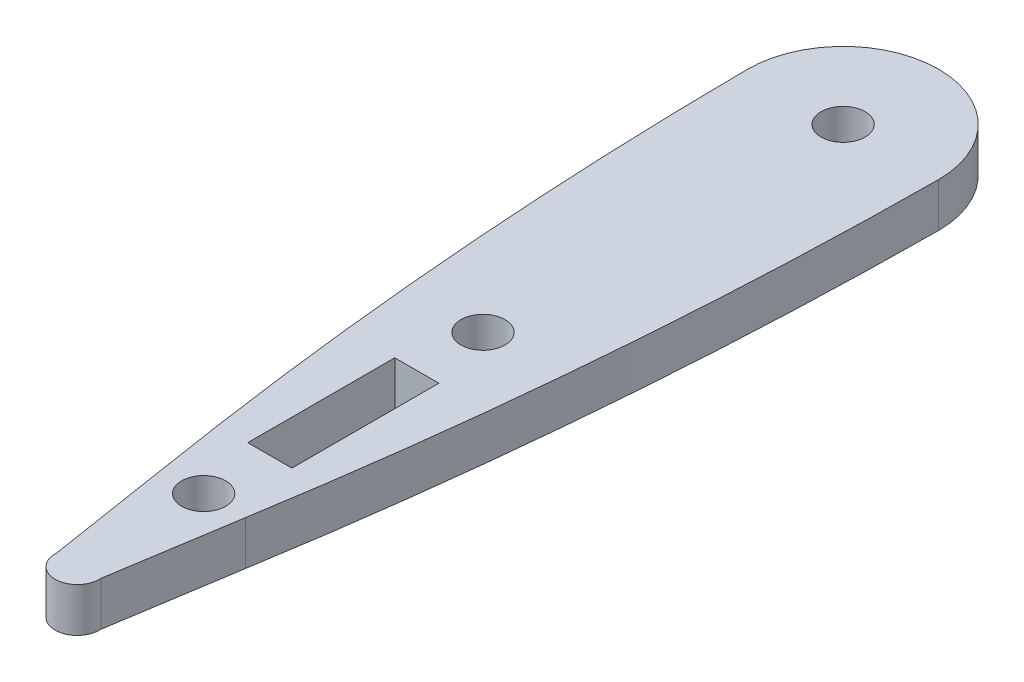
ISO-10303-21;
HEADER;
FILE_DESCRIPTION(('STEP AP214'),'2;1');
FILE_NAME('part.step','',(''),(''),'','','');
FILE_SCHEMA(('AUTOMOTIVE_DESIGN { 1 0 10303 214 1 1 1 1 }'));
ENDSEC;
DATA;
#1=APPLICATION_CONTEXT('core data for automotive mechanical design processes');
#2=APPLICATION_PROTOCOL_DEFINITION('international standard','automotive_design',2000,#1);
#3=PRODUCT_CONTEXT('',#1,'mechanical');
#4=PRODUCT('Part','Part','',(#3));
#5=PRODUCT_RELATED_PRODUCT_CATEGORY('part','',(#4));
#6=PRODUCT_DEFINITION_FORMATION('','',#4);
#7=PRODUCT_DEFINITION_CONTEXT('part definition',#1,'design');
#8=PRODUCT_DEFINITION('design','',#6,#7);
#9=PRODUCT_DEFINITION_SHAPE('','',#8);
#10=(LENGTH_UNIT() NAMED_UNIT(*) SI_UNIT(.MILLI.,.METRE.));
#11=(NAMED_UNIT(*) PLANE_ANGLE_UNIT() SI_UNIT($,.RADIAN.));
#12=(NAMED_UNIT(*) SI_UNIT($,.STERADIAN.) SOLID_ANGLE_UNIT());
#13=UNCERTAINTY_MEASURE_WITH_UNIT(LENGTH_MEASURE(1.E-05),#10,'distance_accuracy_value','');
#14=(GEOMETRIC_REPRESENTATION_CONTEXT(3) GLOBAL_UNCERTAINTY_ASSIGNED_CONTEXT((#13)) GLOBAL_UNIT_ASSIGNED_CONTEXT((#10,
#11,#12)) REPRESENTATION_CONTEXT('',''));
#15=CARTESIAN_POINT('',(0.,0.,0.));
#16=DIRECTION('',(0.,0.,1.));
#17=DIRECTION('',(1.,0.,0.));
#18=AXIS2_PLACEMENT_3D('',#15,#16,#17);
#19=CARTESIAN_POINT('',(-6.68295913760338,3.,1.05274298810732));
#20=DIRECTION('',(-0.987818942901524,0.,0.155607634918458));
#21=DIRECTION('',(0.155607634918458,0.,0.987818942901524));
#22=AXIS2_PLACEMENT_3D('',#19,#20,#21);
#23=PLANE('',#22);
#24=DIRECTION('',(-0.155607634918458,0.,-0.987818942901524));
#25=VECTOR('',#24,1.);
#26=CARTESIAN_POINT('',(-6.68295913760338,0.,1.05274298810732));
#27=LINE('',#26,#25);
#28=CARTESIAN_POINT('',(-1.49999999999999,0.,33.9548895896676));
#29=VERTEX_POINT('',#28);
#30=CARTESIAN_POINT('',(-2.83897502807733,0.,25.4548895896676));
#31=VERTEX_POINT('',#30);
#32=EDGE_CURVE('E172',#29,#31,#27,.T.);
#33=ORIENTED_EDGE('',*,*,#32,.F.);
#34=DIRECTION('',(0.,-1.,0.));
#35=VECTOR('',#34,1.);
#36=CARTESIAN_POINT('',(-1.49999999999999,3.,33.9548895896676));
#37=LINE('',#36,#35);
#38=CARTESIAN_POINT('',(-1.49999999999999,3.,33.9548895896676));
#39=VERTEX_POINT('',#38);
#40=EDGE_CURVE('E11',#39,#29,#37,.T.);
#41=ORIENTED_EDGE('',*,*,#40,.F.);
#42=DIRECTION('',(-0.155607634918458,0.,-0.987818942901524));
#43=VECTOR('',#42,1.);
#44=CARTESIAN_POINT('',(-6.68295913760338,3.,1.05274298810732));
#45=LINE('',#44,#43);
#46=CARTESIAN_POINT('',(-2.83897502807733,3.,25.4548895896676));
#47=VERTEX_POINT('',#46);
#48=EDGE_CURVE('E199',#39,#47,#45,.T.);
#49=ORIENTED_EDGE('',*,*,#48,.T.);
#50=DIRECTION('',(0.,-1.,0.));
#51=VECTOR('',#50,1.);
#52=CARTESIAN_POINT('',(-2.83897502807733,3.,25.4548895896676));
#53=LINE('',#52,#51);
#54=EDGE_CURVE('E53',#47,#31,#53,.T.);
#55=ORIENTED_EDGE('',*,*,#54,.T.);
#56=EDGE_LOOP('',(#33,#41,#49,#55));
#57=FACE_BOUND('',#56,.T.);
#58=ADVANCED_FACE('F34',(#57),#23,.T.);
#59=CARTESIAN_POINT('',(0.,3.,34.053618364937));
#60=DIRECTION('',(0.,-1.,0.));
#61=DIRECTION('',(0.,0.,-1.));
#62=AXIS2_PLACEMENT_3D('',#59,#60,#61);
#63=CYLINDRICAL_SURFACE('',#62,1.50324561235554);
#64=CARTESIAN_POINT('',(0.,0.,34.053618364937));
#65=DIRECTION('',(0.,1.,0.));
#66=DIRECTION('',(0.,0.,1.));
#67=AXIS2_PLACEMENT_3D('',#64,#65,#66);
#68=CIRCLE('',#67,1.50324561235554);
#69=CARTESIAN_POINT('',(1.50000000000001,0.,33.9548895896676));
#70=VERTEX_POINT('',#69);
#71=EDGE_CURVE('E169',#29,#70,#68,.T.);
#72=ORIENTED_EDGE('',*,*,#71,.T.);
#73=DIRECTION('',(0.,-1.,0.));
#74=VECTOR('',#73,1.);
#75=CARTESIAN_POINT('',(1.50000000000001,3.,33.9548895896676));
#76=LINE('',#75,#74);
#77=CARTESIAN_POINT('',(1.50000000000001,3.,33.9548895896676));
#78=VERTEX_POINT('',#77);
#79=EDGE_CURVE('E44',#78,#70,#76,.T.);
#80=ORIENTED_EDGE('',*,*,#79,.F.);
#81=CARTESIAN_POINT('',(0.,3.,34.053618364937));
#82=DIRECTION('',(0.,1.,0.));
#83=DIRECTION('',(0.,0.,1.));
#84=AXIS2_PLACEMENT_3D('',#81,#82,#83);
#85=CIRCLE('',#84,1.50324561235554);
#86=EDGE_CURVE('E197',#39,#78,#85,.T.);
#87=ORIENTED_EDGE('',*,*,#86,.F.);
#88=ORIENTED_EDGE('',*,*,#40,.T.);
#89=EDGE_LOOP('',(#72,#80,#87,#88));
#90=FACE_BOUND('',#89,.T.);
#91=ADVANCED_FACE('F252',(#90),#63,.T.);
#92=CARTESIAN_POINT('',(6.68295913760763,3.,1.05274298810889));
#93=DIRECTION('',(-0.987818942901503,0.,-0.155607634918589));
#94=DIRECTION('',(-0.155607634918589,0.,0.987818942901503));
#95=AXIS2_PLACEMENT_3D('',#92,#93,#94);
#96=PLANE('',#95);
#97=DIRECTION('',(0.155607634918589,0.,-0.987818942901503));
#98=VECTOR('',#97,1.);
#99=CARTESIAN_POINT('',(6.68295913760763,0.,1.05274298810889));
#100=LINE('',#99,#98);
#101=CARTESIAN_POINT('',(2.8389750280785,0.,25.4548895896676));
#102=VERTEX_POINT('',#101);
#103=EDGE_CURVE('E166',#70,#102,#100,.T.);
#104=ORIENTED_EDGE('',*,*,#103,.T.);
#105=DIRECTION('',(0.,-1.,0.));
#106=VECTOR('',#105,1.);
#107=CARTESIAN_POINT('',(2.8389750280785,3.,25.4548895896676));
#108=LINE('',#107,#106);
#109=CARTESIAN_POINT('',(2.8389750280785,3.,25.4548895896676));
#110=VERTEX_POINT('',#109);
#111=EDGE_CURVE('E140',#110,#102,#108,.T.);
#112=ORIENTED_EDGE('',*,*,#111,.F.);
#113=DIRECTION('',(0.155607634918589,0.,-0.987818942901503));
#114=VECTOR('',#113,1.);
#115=CARTESIAN_POINT('',(6.68295913760763,3.,1.05274298810889));
#116=LINE('',#115,#114);
#117=EDGE_CURVE('E133',#78,#110,#116,.T.);
#118=ORIENTED_EDGE('',*,*,#117,.F.);
#119=ORIENTED_EDGE('',*,*,#79,.T.);
#120=EDGE_LOOP('',(#104,#112,#118,#119));
#121=FACE_BOUND('',#120,.T.);
#122=ADVANCED_FACE('F257',(#121),#96,.F.);
#123=CARTESIAN_POINT('',(-275.460870532675,3.,-19.8712997483175));
#124=DIRECTION('',(0.,-1.,0.));
#125=DIRECTION('',(0.,0.,-1.));
#126=AXIS2_PLACEMENT_3D('',#123,#124,#125);
#127=CYLINDRICAL_SURFACE('',#126,281.96678435419);
#128=CARTESIAN_POINT('',(-275.460870532675,0.,-19.8712997483175));
#129=DIRECTION('',(0.,1.,0.));
#130=DIRECTION('',(0.,0.,1.));
#131=AXIS2_PLACEMENT_3D('',#128,#129,#130);
#132=CIRCLE('',#131,281.96678435419);
#133=CARTESIAN_POINT('',(6.50000000000003,0.,-18.0451104103327));
#134=VERTEX_POINT('',#133);
#135=EDGE_CURVE('E139',#102,#134,#132,.T.);
#136=ORIENTED_EDGE('',*,*,#135,.T.);
#137=DIRECTION('',(0.,-1.,0.));
#138=VECTOR('',#137,1.);
#139=CARTESIAN_POINT('',(6.50000000000003,3.,-18.0451104103327));
#140=LINE('',#139,#138);
#141=CARTESIAN_POINT('',(6.50000000000003,3.,-18.0451104103327));
#142=VERTEX_POINT('',#141);
#143=EDGE_CURVE('E122',#142,#134,#140,.T.);
#144=ORIENTED_EDGE('',*,*,#143,.F.);
#145=CARTESIAN_POINT('',(-275.460870532675,3.,-19.8712997483175));
#146=DIRECTION('',(0.,1.,0.));
#147=DIRECTION('',(0.,0.,1.));
#148=AXIS2_PLACEMENT_3D('',#145,#146,#147);
#149=CIRCLE('',#148,281.96678435419);
#150=EDGE_CURVE('E127',#110,#142,#149,.T.);
#151=ORIENTED_EDGE('',*,*,#150,.F.);
#152=ORIENTED_EDGE('',*,*,#111,.T.);
#153=EDGE_LOOP('',(#136,#144,#151,#152));
#154=FACE_BOUND('',#153,.T.);
#155=ADVANCED_FACE('F138',(#154),#127,.T.);
#156=CARTESIAN_POINT('',(-4.52762827229947E-13,3.,-18.0451104103996));
#157=DIRECTION('',(0.,-1.,0.));
#158=DIRECTION('',(0.,0.,-1.));
#159=AXIS2_PLACEMENT_3D('',#156,#157,#158);
#160=CYLINDRICAL_SURFACE('',#159,6.50000000000048);
#161=CARTESIAN_POINT('',(-4.52762827229947E-13,0.,-18.0451104103996));
#162=DIRECTION('',(0.,1.,0.));
#163=DIRECTION('',(0.,0.,1.));
#164=AXIS2_PLACEMENT_3D('',#161,#162,#163);
#165=CIRCLE('',#164,6.50000000000048);
#166=CARTESIAN_POINT('',(-6.50000000000093,0.,-18.0451104106928));
#167=VERTEX_POINT('',#166);
#168=EDGE_CURVE('E163',#134,#167,#165,.T.);
#169=ORIENTED_EDGE('',*,*,#168,.T.);
#170=DIRECTION('',(0.,-1.,0.));
#171=VECTOR('',#170,1.);
#172=CARTESIAN_POINT('',(-6.50000000000093,3.,-18.0451104106928));
#173=LINE('',#172,#171);
#174=CARTESIAN_POINT('',(-6.50000000000093,3.,-18.0451104106928));
#175=VERTEX_POINT('',#174);
#176=EDGE_CURVE('E85',#175,#167,#173,.T.);
#177=ORIENTED_EDGE('',*,*,#176,.F.);
#178=CARTESIAN_POINT('',(-4.52762827229947E-13,3.,-18.0451104103996));
#179=DIRECTION('',(0.,1.,0.));
#180=DIRECTION('',(0.,0.,1.));
#181=AXIS2_PLACEMENT_3D('',#178,#179,#180);
#182=CIRCLE('',#181,6.50000000000048);
#183=EDGE_CURVE('E118',#142,#175,#182,.T.);
#184=ORIENTED_EDGE('',*,*,#183,.F.);
#185=ORIENTED_EDGE('',*,*,#143,.T.);
#186=EDGE_LOOP('',(#169,#177,#184,#185));
#187=FACE_BOUND('',#186,.T.);
#188=ADVANCED_FACE('F120',(#187),#160,.T.);
#189=CARTESIAN_POINT('',(0.,3.,20.9548895896676));
#190=DIRECTION('',(0.,0.,-1.));
#191=DIRECTION('',(-1.,0.,0.));
#192=AXIS2_PLACEMENT_3D('',#189,#190,#191);
#193=PLANE('',#192);
#194=DIRECTION('',(1.,0.,0.));
#195=VECTOR('',#194,1.);
#196=CARTESIAN_POINT('',(0.,0.,20.9548895896676));
#197=LINE('',#196,#195);
#198=CARTESIAN_POINT('',(-1.49999999999992,0.,20.9548895896676));
#199=VERTEX_POINT('',#198);
#200=CARTESIAN_POINT('',(1.50000000000009,0.,20.9548895896676));
#201=VERTEX_POINT('',#200);
#202=EDGE_CURVE('E189',#199,#201,#197,.T.);
#203=ORIENTED_EDGE('',*,*,#202,.F.);
#204=DIRECTION('',(0.,-1.,0.));
#205=VECTOR('',#204,1.);
#206=CARTESIAN_POINT('',(-1.49999999999992,3.,20.9548895896676));
#207=LINE('',#206,#205);
#208=CARTESIAN_POINT('',(-1.49999999999992,3.,20.9548895896676));
#209=VERTEX_POINT('',#208);
#210=EDGE_CURVE('E38',#209,#199,#207,.T.);
#211=ORIENTED_EDGE('',*,*,#210,.F.);
#212=DIRECTION('',(1.,0.,0.));
#213=VECTOR('',#212,1.);
#214=CARTESIAN_POINT('',(0.,3.,20.9548895896676));
#215=LINE('',#214,#213);
#216=CARTESIAN_POINT('',(1.50000000000009,3.,20.9548895896676));
#217=VERTEX_POINT('',#216);
#218=EDGE_CURVE('E213',#209,#217,#215,.T.);
#219=ORIENTED_EDGE('',*,*,#218,.T.);
#220=DIRECTION('',(0.,-1.,0.));
#221=VECTOR('',#220,1.);
#222=CARTESIAN_POINT('',(1.50000000000009,3.,20.9548895896676));
#223=LINE('',#222,#221);
#224=EDGE_CURVE('E148',#217,#201,#223,.T.);
#225=ORIENTED_EDGE('',*,*,#224,.T.);
#226=EDGE_LOOP('',(#203,#211,#219,#225));
#227=FACE_BOUND('',#226,.T.);
#228=ADVANCED_FACE('F272',(#227),#193,.T.);
#229=CARTESIAN_POINT('',(-1.49999999999992,3.,0.));
#230=DIRECTION('',(1.,0.,0.));
#231=DIRECTION('',(0.,0.,-1.));
#232=AXIS2_PLACEMENT_3D('',#229,#230,#231);
#233=PLANE('',#232);
#234=DIRECTION('',(0.,0.,1.));
#235=VECTOR('',#234,1.);
#236=CARTESIAN_POINT('',(-1.49999999999992,0.,0.));
#237=LINE('',#236,#235);
#238=CARTESIAN_POINT('',(-1.49999999999992,0.,10.9548895896676));
#239=VERTEX_POINT('',#238);
#240=EDGE_CURVE('E186',#239,#199,#237,.T.);
#241=ORIENTED_EDGE('',*,*,#240,.F.);
#242=DIRECTION('',(0.,-1.,0.));
#243=VECTOR('',#242,1.);
#244=CARTESIAN_POINT('',(-1.49999999999992,3.,10.9548895896676));
#245=LINE('',#244,#243);
#246=CARTESIAN_POINT('',(-1.49999999999992,3.,10.9548895896676));
#247=VERTEX_POINT('',#246);
#248=EDGE_CURVE('E151',#247,#239,#245,.T.);
#249=ORIENTED_EDGE('',*,*,#248,.F.);
#250=DIRECTION('',(0.,0.,1.));
#251=VECTOR('',#250,1.);
#252=CARTESIAN_POINT('',(-1.49999999999992,3.,0.));
#253=LINE('',#252,#251);
#254=EDGE_CURVE('E211',#247,#209,#253,.T.);
#255=ORIENTED_EDGE('',*,*,#254,.T.);
#256=ORIENTED_EDGE('',*,*,#210,.T.);
#257=EDGE_LOOP('',(#241,#249,#255,#256));
#258=FACE_BOUND('',#257,.T.);
#259=ADVANCED_FACE('F270',(#258),#233,.T.);
#260=CARTESIAN_POINT('',(0.,3.,10.9548895896676));
#261=DIRECTION('',(0.,0.,1.));
#262=DIRECTION('',(1.,0.,0.));
#263=AXIS2_PLACEMENT_3D('',#260,#261,#262);
#264=PLANE('',#263);
#265=DIRECTION('',(-1.,0.,0.));
#266=VECTOR('',#265,1.);
#267=CARTESIAN_POINT('',(0.,0.,10.9548895896676));
#268=LINE('',#267,#266);
#269=CARTESIAN_POINT('',(1.50000000000009,0.,10.9548895896676));
#270=VERTEX_POINT('',#269);
#271=EDGE_CURVE('E183',#270,#239,#268,.T.);
#272=ORIENTED_EDGE('',*,*,#271,.F.);
#273=DIRECTION('',(0.,-1.,0.));
#274=VECTOR('',#273,1.);
#275=CARTESIAN_POINT('',(1.50000000000009,3.,10.9548895896676));
#276=LINE('',#275,#274);
#277=CARTESIAN_POINT('',(1.50000000000009,3.,10.9548895896676));
#278=VERTEX_POINT('',#277);
#279=EDGE_CURVE('E150',#278,#270,#276,.T.);
#280=ORIENTED_EDGE('',*,*,#279,.F.);
#281=DIRECTION('',(-1.,0.,0.));
#282=VECTOR('',#281,1.);
#283=CARTESIAN_POINT('',(0.,3.,10.9548895896676));
#284=LINE('',#283,#282);
#285=EDGE_CURVE('E209',#278,#247,#284,.T.);
#286=ORIENTED_EDGE('',*,*,#285,.T.);
#287=ORIENTED_EDGE('',*,*,#248,.T.);
#288=EDGE_LOOP('',(#272,#280,#286,#287));
#289=FACE_BOUND('',#288,.T.);
#290=ADVANCED_FACE('F235',(#289),#264,.T.);
#291=CARTESIAN_POINT('',(0.,3.,25.4548895896676));
#292=DIRECTION('',(0.,-1.,0.));
#293=DIRECTION('',(0.,0.,-1.));
#294=AXIS2_PLACEMENT_3D('',#291,#292,#293);
#295=CYLINDRICAL_SURFACE('',#294,1.5);
#296=CARTESIAN_POINT('',(0.,3.,25.4548895896676));
#297=DIRECTION('',(0.,1.,0.));
#298=DIRECTION('',(0.,0.,1.));
#299=AXIS2_PLACEMENT_3D('',#296,#297,#298);
#300=CIRCLE('',#299,1.5);
#301=CARTESIAN_POINT('',(0.,3.,26.9548895896676));
#302=VERTEX_POINT('',#301);
#303=EDGE_CURVE('E201',#302,#302,#300,.T.);
#304=ORIENTED_EDGE('',*,*,#303,.T.);
#305=EDGE_LOOP('',(#304));
#306=FACE_BOUND('',#305,.T.);
#307=CARTESIAN_POINT('',(0.,0.,25.4548895896676));
#308=DIRECTION('',(0.,1.,0.));
#309=DIRECTION('',(0.,0.,1.));
#310=AXIS2_PLACEMENT_3D('',#307,#308,#309);
#311=CIRCLE('',#310,1.5);
#312=CARTESIAN_POINT('',(0.,0.,26.9548895896676));
#313=VERTEX_POINT('',#312);
#314=EDGE_CURVE('E174',#313,#313,#311,.T.);
#315=ORIENTED_EDGE('',*,*,#314,.F.);
#316=EDGE_LOOP('',(#315));
#317=FACE_BOUND('',#316,.T.);
#318=ADVANCED_FACE('F231',(#306,#317),#295,.F.);
#319=CARTESIAN_POINT('',(0.,3.,6.45488958966763));
#320=DIRECTION('',(0.,-1.,0.));
#321=DIRECTION('',(0.,0.,-1.));
#322=AXIS2_PLACEMENT_3D('',#319,#320,#321);
#323=CYLINDRICAL_SURFACE('',#322,1.5);
#324=CARTESIAN_POINT('',(0.,3.,6.45488958966763));
#325=DIRECTION('',(0.,1.,0.));
#326=DIRECTION('',(0.,0.,1.));
#327=AXIS2_PLACEMENT_3D('',#324,#325,#326);
#328=CIRCLE('',#327,1.5);
#329=CARTESIAN_POINT('',(0.,3.,7.95488958966763));
#330=VERTEX_POINT('',#329);
#331=EDGE_CURVE('E204',#330,#330,#328,.T.);
#332=ORIENTED_EDGE('',*,*,#331,.T.);
#333=EDGE_LOOP('',(#332));
#334=FACE_BOUND('',#333,.T.);
#335=CARTESIAN_POINT('',(0.,0.,6.45488958966763));
#336=DIRECTION('',(0.,1.,0.));
#337=DIRECTION('',(0.,0.,1.));
#338=AXIS2_PLACEMENT_3D('',#335,#336,#337);
#339=CIRCLE('',#338,1.5);
#340=CARTESIAN_POINT('',(0.,0.,7.95488958966763));
#341=VERTEX_POINT('',#340);
#342=EDGE_CURVE('E177',#341,#341,#339,.T.);
#343=ORIENTED_EDGE('',*,*,#342,.F.);
#344=EDGE_LOOP('',(#343));
#345=FACE_BOUND('',#344,.T.);
#346=ADVANCED_FACE('F234',(#334,#345),#323,.F.);
#347=CARTESIAN_POINT('',(1.50000000000009,3.,0.));
#348=DIRECTION('',(1.,0.,0.));
#349=DIRECTION('',(0.,0.,-1.));
#350=AXIS2_PLACEMENT_3D('',#347,#348,#349);
#351=PLANE('',#350);
#352=DIRECTION('',(0.,0.,1.));
#353=VECTOR('',#352,1.);
#354=CARTESIAN_POINT('',(1.50000000000009,0.,0.));
#355=LINE('',#354,#353);
#356=EDGE_CURVE('E180',#270,#201,#355,.T.);
#357=ORIENTED_EDGE('',*,*,#356,.T.);
#358=ORIENTED_EDGE('',*,*,#224,.F.);
#359=DIRECTION('',(0.,0.,1.));
#360=VECTOR('',#359,1.);
#361=CARTESIAN_POINT('',(1.50000000000009,3.,0.));
#362=LINE('',#361,#360);
#363=EDGE_CURVE('E207',#278,#217,#362,.T.);
#364=ORIENTED_EDGE('',*,*,#363,.F.);
#365=ORIENTED_EDGE('',*,*,#279,.T.);
#366=EDGE_LOOP('',(#357,#358,#364,#365));
#367=FACE_BOUND('',#366,.T.);
#368=ADVANCED_FACE('F249',(#367),#351,.F.);
#369=CARTESIAN_POINT('',(-4.52762827229947E-13,3.,-18.0451104103996));
#370=DIRECTION('',(0.,-1.,0.));
#371=DIRECTION('',(0.,0.,-1.));
#372=AXIS2_PLACEMENT_3D('',#369,#370,#371);
#373=CYLINDRICAL_SURFACE('',#372,1.49999999998078);
#374=CARTESIAN_POINT('',(-4.52762827229947E-13,3.,-18.0451104103996));
#375=DIRECTION('',(0.,1.,0.));
#376=DIRECTION('',(0.,0.,1.));
#377=AXIS2_PLACEMENT_3D('',#374,#375,#376);
#378=CIRCLE('',#377,1.49999999998078);
#379=CARTESIAN_POINT('',(-4.52762827229947E-13,3.,-16.5451104104188));
#380=VERTEX_POINT('',#379);
#381=EDGE_CURVE('E162',#380,#380,#378,.T.);
#382=ORIENTED_EDGE('',*,*,#381,.T.);
#383=EDGE_LOOP('',(#382));
#384=FACE_BOUND('',#383,.T.);
#385=CARTESIAN_POINT('',(-4.52762827229947E-13,0.,-18.0451104103996));
#386=DIRECTION('',(0.,1.,0.));
#387=DIRECTION('',(0.,0.,1.));
#388=AXIS2_PLACEMENT_3D('',#385,#386,#387);
#389=CIRCLE('',#388,1.49999999998078);
#390=CARTESIAN_POINT('',(-4.52762827229947E-13,0.,-16.5451104104188));
#391=VERTEX_POINT('',#390);
#392=EDGE_CURVE('E192',#391,#391,#389,.T.);
#393=ORIENTED_EDGE('',*,*,#392,.F.);
#394=EDGE_LOOP('',(#393));
#395=FACE_BOUND('',#394,.T.);
#396=ADVANCED_FACE('F36',(#384,#395),#373,.F.);
#397=CARTESIAN_POINT('',(275.460870532676,3.,-19.8712997483175));
#398=DIRECTION('',(0.,-1.,0.));
#399=DIRECTION('',(0.,0.,-1.));
#400=AXIS2_PLACEMENT_3D('',#397,#398,#399);
#401=CYLINDRICAL_SURFACE('',#400,281.966784354189);
#402=CARTESIAN_POINT('',(275.460870532676,0.,-19.8712997483175));
#403=DIRECTION('',(0.,1.,0.));
#404=DIRECTION('',(0.,0.,1.));
#405=AXIS2_PLACEMENT_3D('',#402,#403,#404);
#406=CIRCLE('',#405,281.966784354189);
#407=EDGE_CURVE('E159',#31,#167,#406,.F.);
#408=ORIENTED_EDGE('',*,*,#407,.F.);
#409=ORIENTED_EDGE('',*,*,#54,.F.);
#410=CARTESIAN_POINT('',(275.460870532676,3.,-19.8712997483175));
#411=DIRECTION('',(0.,1.,0.));
#412=DIRECTION('',(0.,0.,1.));
#413=AXIS2_PLACEMENT_3D('',#410,#411,#412);
#414=CIRCLE('',#413,281.966784354189);
#415=EDGE_CURVE('E126',#47,#175,#414,.F.);
#416=ORIENTED_EDGE('',*,*,#415,.T.);
#417=ORIENTED_EDGE('',*,*,#176,.T.);
#418=EDGE_LOOP('',(#408,#409,#416,#417));
#419=FACE_BOUND('',#418,.T.);
#420=ADVANCED_FACE('F223',(#419),#401,.T.);
#421=CARTESIAN_POINT('',(0.,3.,0.));
#422=DIRECTION('',(0.,1.,0.));
#423=DIRECTION('',(0.,0.,1.));
#424=AXIS2_PLACEMENT_3D('',#421,#422,#423);
#425=PLANE('',#424);
#426=ORIENTED_EDGE('',*,*,#381,.F.);
#427=EDGE_LOOP('',(#426));
#428=FACE_BOUND('',#427,.T.);
#429=ORIENTED_EDGE('',*,*,#218,.F.);
#430=ORIENTED_EDGE('',*,*,#254,.F.);
#431=ORIENTED_EDGE('',*,*,#285,.F.);
#432=ORIENTED_EDGE('',*,*,#363,.T.);
#433=EDGE_LOOP('',(#429,#430,#431,#432));
#434=FACE_BOUND('',#433,.T.);
#435=ORIENTED_EDGE('',*,*,#331,.F.);
#436=EDGE_LOOP('',(#435));
#437=FACE_BOUND('',#436,.T.);
#438=ORIENTED_EDGE('',*,*,#303,.F.);
#439=EDGE_LOOP('',(#438));
#440=FACE_BOUND('',#439,.T.);
#441=ORIENTED_EDGE('',*,*,#48,.F.);
#442=ORIENTED_EDGE('',*,*,#86,.T.);
#443=ORIENTED_EDGE('',*,*,#117,.T.);
#444=ORIENTED_EDGE('',*,*,#150,.T.);
#445=ORIENTED_EDGE('',*,*,#183,.T.);
#446=ORIENTED_EDGE('',*,*,#415,.F.);
#447=EDGE_LOOP('',(#441,#442,#443,#444,#445,#446));
#448=FACE_BOUND('',#447,.T.);
#449=ADVANCED_FACE('F131',(#428,#434,#437,#440,#448),#425,.T.);
#450=CARTESIAN_POINT('',(0.,0.,0.));
#451=DIRECTION('',(0.,1.,0.));
#452=DIRECTION('',(0.,0.,1.));
#453=AXIS2_PLACEMENT_3D('',#450,#451,#452);
#454=PLANE('',#453);
#455=ORIENTED_EDGE('',*,*,#392,.T.);
#456=EDGE_LOOP('',(#455));
#457=FACE_BOUND('',#456,.T.);
#458=ORIENTED_EDGE('',*,*,#202,.T.);
#459=ORIENTED_EDGE('',*,*,#356,.F.);
#460=ORIENTED_EDGE('',*,*,#271,.T.);
#461=ORIENTED_EDGE('',*,*,#240,.T.);
#462=EDGE_LOOP('',(#458,#459,#460,#461));
#463=FACE_BOUND('',#462,.T.);
#464=ORIENTED_EDGE('',*,*,#342,.T.);
#465=EDGE_LOOP('',(#464));
#466=FACE_BOUND('',#465,.T.);
#467=ORIENTED_EDGE('',*,*,#314,.T.);
#468=EDGE_LOOP('',(#467));
#469=FACE_BOUND('',#468,.T.);
#470=ORIENTED_EDGE('',*,*,#32,.T.);
#471=ORIENTED_EDGE('',*,*,#407,.T.);
#472=ORIENTED_EDGE('',*,*,#168,.F.);
#473=ORIENTED_EDGE('',*,*,#135,.F.);
#474=ORIENTED_EDGE('',*,*,#103,.F.);
#475=ORIENTED_EDGE('',*,*,#71,.F.);
#476=EDGE_LOOP('',(#470,#471,#472,#473,#474,#475));
#477=FACE_BOUND('',#476,.T.);
#478=ADVANCED_FACE('F222',(#457,#463,#466,#469,#477),#454,.F.);
#479=CLOSED_SHELL('',(#58,#91,#122,#155,#188,#228,#259,#290,#318,#346,#368,#396,#420,#449,#478));
#480=MANIFOLD_SOLID_BREP('B2',#479);
#481=ADVANCED_BREP_SHAPE_REPRESENTATION('',(#18,#480),#14);
#482=SHAPE_DEFINITION_REPRESENTATION(#9,#481);
ENDSEC;
END-ISO-10303-21;
